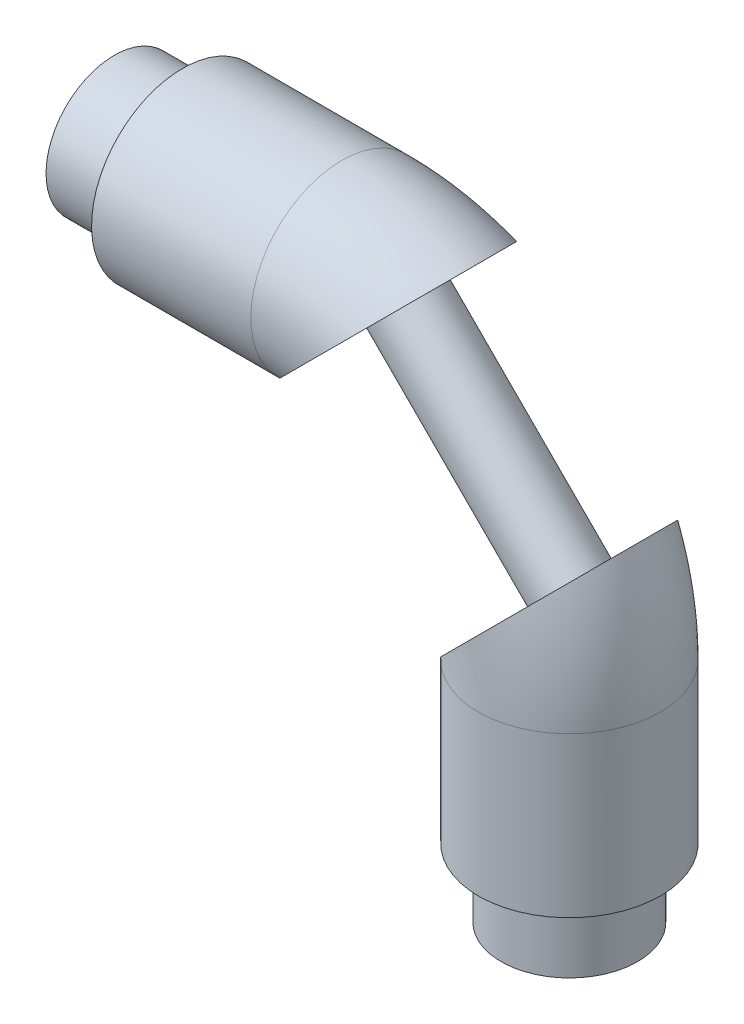
ISO-10303-21;
HEADER;
FILE_DESCRIPTION(('STEP AP214'),'2;1');
FILE_NAME('part.step','',(''),(''),'','','');
FILE_SCHEMA(('AUTOMOTIVE_DESIGN { 1 0 10303 214 1 1 1 1 }'));
ENDSEC;
DATA;
#1=APPLICATION_CONTEXT('core data for automotive mechanical design processes');
#2=APPLICATION_PROTOCOL_DEFINITION('international standard','automotive_design',2000,#1);
#3=PRODUCT_CONTEXT('',#1,'mechanical');
#4=PRODUCT('Part','Part','',(#3));
#5=PRODUCT_RELATED_PRODUCT_CATEGORY('part','',(#4));
#6=PRODUCT_DEFINITION_FORMATION('','',#4);
#7=PRODUCT_DEFINITION_CONTEXT('part definition',#1,'design');
#8=PRODUCT_DEFINITION('design','',#6,#7);
#9=PRODUCT_DEFINITION_SHAPE('','',#8);
#10=(LENGTH_UNIT() NAMED_UNIT(*) SI_UNIT(.MILLI.,.METRE.));
#11=(NAMED_UNIT(*) PLANE_ANGLE_UNIT() SI_UNIT($,.RADIAN.));
#12=(NAMED_UNIT(*) SI_UNIT($,.STERADIAN.) SOLID_ANGLE_UNIT());
#13=UNCERTAINTY_MEASURE_WITH_UNIT(LENGTH_MEASURE(1.E-05),#10,'distance_accuracy_value','');
#14=(GEOMETRIC_REPRESENTATION_CONTEXT(3) GLOBAL_UNCERTAINTY_ASSIGNED_CONTEXT((#13)) GLOBAL_UNIT_ASSIGNED_CONTEXT((#10,
#11,#12)) REPRESENTATION_CONTEXT('',''));
#15=CARTESIAN_POINT('',(0.,0.,0.));
#16=DIRECTION('',(0.,0.,1.));
#17=DIRECTION('',(1.,0.,0.));
#18=AXIS2_PLACEMENT_3D('',#15,#16,#17);
#19=CARTESIAN_POINT('',(-10.,10.,0.));
#20=DIRECTION('',(0.,0.,1.));
#21=DIRECTION('',(1.,0.,0.));
#22=AXIS2_PLACEMENT_3D('',#19,#20,#21);
#23=TOROIDAL_SURFACE('',#22,10.,4.);
#24=CARTESIAN_POINT('',(-10.0002,17.0708678118654,-2.72400158608691));
#25=CARTESIAN_POINT('',(-9.95265168058463,17.1184161312808,-2.77512351927115));
#26=CARTESIAN_POINT('',(-9.90437490872097,17.1666929031444,-2.82487186485191));
#27=CARTESIAN_POINT('',(-9.80645600651633,17.2646118053491,-2.92159553685316));
#28=CARTESIAN_POINT('',(-9.75681396128956,17.3142538505759,-2.96857103556728));
#29=CARTESIAN_POINT('',(-9.60597353217835,17.4650942796871,-3.10530395324048));
#30=CARTESIAN_POINT('',(-9.50285579575952,17.5682120161059,-3.1908732176818));
#31=CARTESIAN_POINT('',(-9.29149340002958,17.7795744118358,-3.35088564511738));
#32=CARTESIAN_POINT('',(-9.18321845588592,17.8878493559795,-3.42524856610428));
#33=CARTESIAN_POINT('',(-8.962806169225,18.1082616426404,-3.5615165804673));
#34=CARTESIAN_POINT('',(-8.85066872107243,18.220399090793,-3.62342133280868));
#35=CARTESIAN_POINT('',(-8.61637715649702,18.4546906553684,-3.73731465571486));
#36=CARTESIAN_POINT('',(-8.49402463488474,18.5770431769807,-3.78849099694695));
#37=CARTESIAN_POINT('',(-8.24655110474179,18.8245167071236,-3.87500879943189));
#38=CARTESIAN_POINT('',(-8.12143038506766,18.9496374267978,-3.91035190475286));
#39=CARTESIAN_POINT('',(-7.86973186621318,19.2013359456523,-3.96412494210874));
#40=CARTESIAN_POINT('',(-7.74315916511407,19.3279086467514,-3.9826022426813));
#41=CARTESIAN_POINT('',(-7.48935148050852,19.5817163313569,-4.00184224684835));
#42=CARTESIAN_POINT('',(-7.362116731082,19.7089510807834,-4.00261083560131));
#43=CARTESIAN_POINT('',(-7.13971991290245,19.931347898963,-3.98770779226969));
#44=CARTESIAN_POINT('',(-7.04441623408392,20.0266515777815,-3.97605930903692));
#45=CARTESIAN_POINT('',(-6.85478445350626,20.2162833583592,-3.94196996418255));
#46=CARTESIAN_POINT('',(-6.76045616073202,20.3106116511334,-3.9195312581839));
#47=CARTESIAN_POINT('',(-6.57340628812681,20.4976615237386,-3.86362840285953));
#48=CARTESIAN_POINT('',(-6.480685294171,20.5903825176945,-3.83016031862299));
#49=CARTESIAN_POINT('',(-6.29765734907611,20.7734104627893,-3.75209168535022));
#50=CARTESIAN_POINT('',(-6.20734925730838,20.8637185545571,-3.70749650322021));
#51=CARTESIAN_POINT('',(-6.0293468570954,21.0417209547701,-3.60685052347472));
#52=CARTESIAN_POINT('',(-5.94167142228141,21.129396389584,-3.55073277535727));
#53=CARTESIAN_POINT('',(-5.77037271707273,21.3006950947927,-3.42735612085415));
#54=CARTESIAN_POINT('',(-5.68674762160756,21.3843201902579,-3.36010229386694));
#55=CARTESIAN_POINT('',(-5.52437008769593,21.5466977241695,-3.21471507728029));
#56=CARTESIAN_POINT('',(-5.44561721175032,21.6254506001151,-3.13658266657318));
#57=CARTESIAN_POINT('',(-5.29384678067927,21.7772210311862,-2.96987545736549));
#58=CARTESIAN_POINT('',(-5.22082852025835,21.8502392916071,-2.88130194636865));
#59=CARTESIAN_POINT('',(-5.08865402168215,21.9824137901833,-2.70408513615794));
#60=CARTESIAN_POINT('',(-5.02884626235321,22.0422215495123,-2.6164121104192));
#61=CARTESIAN_POINT('',(-4.91510874951686,22.1559590623486,-2.43375031968751));
#62=CARTESIAN_POINT('',(-4.86117833136077,22.2098894805047,-2.33876238399074));
#63=CARTESIAN_POINT('',(-4.75977428097222,22.3112935308933,-2.14218737374575));
#64=CARTESIAN_POINT('',(-4.71229779557334,22.3587700162921,-2.04060324479666));
#65=CARTESIAN_POINT('',(-4.62428806809412,22.4467797437714,-1.83158675937074));
#66=CARTESIAN_POINT('',(-4.5837543694293,22.4873134424362,-1.72415478808341));
#67=CARTESIAN_POINT('',(-4.51319982508192,22.5578679867835,-1.51363775564464));
#68=CARTESIAN_POINT('',(-4.48257980193672,22.5884880099288,-1.41095346133806));
#69=CARTESIAN_POINT('',(-4.42782014149554,22.6432476703699,-1.20214105494106));
#70=CARTESIAN_POINT('',(-4.40368263705275,22.6673851748127,-1.09601182225193));
#71=CARTESIAN_POINT('',(-4.36215411224981,22.7089136996157,-0.881218279841107));
#72=CARTESIAN_POINT('',(-4.34475875967637,22.7263090521891,-0.772555645725331));
#73=CARTESIAN_POINT('',(-4.31686118228197,22.7542066295835,-0.553431501953658));
#74=CARTESIAN_POINT('',(-4.30636143066962,22.7647063811959,-0.442969361419619));
#75=CARTESIAN_POINT('',(-4.29269042616557,22.7783773856999,-0.226225852343734));
#76=CARTESIAN_POINT('',(-4.28920667867313,22.7818611331924,-0.119983667962518));
#77=CARTESIAN_POINT('',(-4.2886546732461,22.7824131386194,0.0925732522416568));
#78=CARTESIAN_POINT('',(-4.29158869936269,22.7794791125028,0.198888000428365));
#79=CARTESIAN_POINT('',(-4.30384727409735,22.7672205377681,0.410726332606928));
#80=CARTESIAN_POINT('',(-4.31316876739452,22.757899044471,0.516250270481975));
#81=CARTESIAN_POINT('',(-4.33811674824839,22.7329510636171,0.725834634159325));
#82=CARTESIAN_POINT('',(-4.35374556564254,22.7173222462229,0.829894504440441));
#83=CARTESIAN_POINT('',(-4.39097358165834,22.6800942302071,1.03470285163442));
#84=CARTESIAN_POINT('',(-4.41250878079811,22.6585590310674,1.13547455134908));
#85=CARTESIAN_POINT('',(-4.4614217335249,22.6096460783406,1.3341527922316));
#86=CARTESIAN_POINT('',(-4.48880158932952,22.582266222536,1.43205828803086));
#87=CARTESIAN_POINT('',(-4.57936044638908,22.4917073654764,1.72041258490704));
#88=CARTESIAN_POINT('',(-4.65099632216701,22.4200714896985,1.9057041018534));
#89=CARTESIAN_POINT('',(-4.81613592812598,22.2549318837395,2.26134650362603));
#90=CARTESIAN_POINT('',(-4.91008566375238,22.1609821481131,2.43127952610876));
#91=CARTESIAN_POINT('',(-5.11591387834778,21.9551539335177,2.74781474210786));
#92=CARTESIAN_POINT('',(-5.22779546749115,21.8432723443743,2.89441287951839));
#93=CARTESIAN_POINT('',(-5.47239842391601,21.5986693879494,3.16854455397854));
#94=CARTESIAN_POINT('',(-5.605905655579,21.4651621562865,3.29467257106363));
#95=CARTESIAN_POINT('',(-5.88507564572725,21.1859921661382,3.51620646760113));
#96=CARTESIAN_POINT('',(-6.03074214564486,21.0403256662206,3.61160284666129));
#97=CARTESIAN_POINT('',(-6.3428171683488,20.7282506435167,3.77763612839986));
#98=CARTESIAN_POINT('',(-6.50994414364555,20.5611236682199,3.84556509035585));
#99=CARTESIAN_POINT('',(-6.84945720863157,20.2216106032339,3.94515610809309));
#100=CARTESIAN_POINT('',(-7.02184480073004,20.0492230111354,3.97680770179296));
#101=CARTESIAN_POINT('',(-7.38763298775499,19.6834348241104,4.00700052907749));
#102=CARTESIAN_POINT('',(-7.58120259637254,19.4898652154929,4.00138664338646));
#103=CARTESIAN_POINT('',(-7.96571650521028,19.1053513066552,3.95017483781603));
#104=CARTESIAN_POINT('',(-8.15665837514364,18.9144094367218,3.90454213937308));
#105=CARTESIAN_POINT('',(-8.55874506848726,18.5123227433782,3.76776437083946));
#106=CARTESIAN_POINT('',(-8.76894879651726,18.3021190153482,3.67111550181167));
#107=CARTESIAN_POINT('',(-9.17692735797655,17.8941404538889,3.43534051279585));
#108=CARTESIAN_POINT('',(-9.37471008818253,17.6963577236829,3.29624171727988));
#109=CARTESIAN_POINT('',(-9.63975891786822,17.4313088939972,3.0749259287925));
#110=CARTESIAN_POINT('',(-9.71394567858342,17.357122133282,3.00884839966494));
#111=CARTESIAN_POINT('',(-9.85933111105519,17.2117367008102,2.87082291167025));
#112=CARTESIAN_POINT('',(-9.9305351900335,17.1405326218319,2.79888633988217));
#113=CARTESIAN_POINT('',(-10.0002,17.0708678118654,2.72400158608691));
#114=B_SPLINE_CURVE_WITH_KNOTS('',3,(#24,#25,#26,#27,#28,#29,#30,#31,#32,#33,#34,#35,#36,#37,
#38,#39,#40,#41,#42,#43,#44,#45,#46,#47,#48,#49,#50,#51,#52,#53,#54,#55,#56,#57,#58,#59,#60,#61,
#62,#63,#64,#65,#66,#67,#68,#69,#70,#71,#72,#73,#74,#75,#76,#77,#78,#79,#80,#81,#82,#83,#84,#85,
#86,#87,#88,#89,#90,#91,#92,#93,#94,#95,#96,#97,#98,#99,#100,#101,#102,#103,#104,#105,#106,#107,
#108,#109,#110,#111,#112,#113),.UNSPECIFIED.,.F.,.F.,(4,2,2,2,2,2,2,2,2,2,2,2,2,2,2,2,2,2,2,2,2,
2,2,2,2,2,2,2,2,2,2,2,2,2,2,2,2,2,2,2,2,2,2,2,4),(0.,0.253370642160092,0.506725524270873,
1.01340843011634,1.52356265310228,2.03373083934824,2.57434425031385,3.11490151284591,
3.65393587701441,4.19279110063007,4.59823687403159,5.00360168290001,5.4091112691333,
5.8144256437214,6.22216530725427,6.62971950193064,7.03723704715323,7.44470439339552,
7.80968501357456,8.17462431640245,8.53940175785564,8.90415520091649,9.2380608528127,
9.57207623083781,9.9058766278921,10.2397966820752,10.5584822336436,10.8772812221425,
11.1959278256839,11.514692240722,11.8301305139273,12.1456824363408,12.7761589726348,
13.4204919941315,14.0649368925746,14.7432257580067,15.4217241091871,16.1564662464066,
16.8914202236728,17.7095971832049,18.5284858892088,19.4626818678849,20.3962777804387,
20.7680824482451,21.1391810077168),.UNSPECIFIED.);
#115=CARTESIAN_POINT('',(-10.,17.0710678118654,-2.72421662819041));
#116=VERTEX_POINT('',#115);
#117=CARTESIAN_POINT('',(-10.,17.0710678118654,2.72421662819041));
#118=VERTEX_POINT('',#117);
#119=EDGE_CURVE('E11',#116,#118,#114,.T.);
#120=ORIENTED_EDGE('',*,*,#119,.F.);
#121=CARTESIAN_POINT('',(-10.,20.,0.));
#122=DIRECTION('',(-1.,0.,0.));
#123=DIRECTION('',(0.,0.,1.));
#124=AXIS2_PLACEMENT_3D('',#121,#122,#123);
#125=CIRCLE('',#124,4.);
#126=EDGE_CURVE('E130',#118,#116,#125,.T.);
#127=ORIENTED_EDGE('',*,*,#126,.F.);
#128=EDGE_LOOP('',(#120,#127));
#129=FACE_BOUND('',#128,.T.);
#130=ADVANCED_FACE('F37',(#129),#23,.T.);
#131=CARTESIAN_POINT('',(-10.,20.,0.));
#132=DIRECTION('',(-1.,0.,0.));
#133=DIRECTION('',(0.,-1.,0.));
#134=AXIS2_PLACEMENT_3D('',#131,#132,#133);
#135=CYLINDRICAL_SURFACE('',#134,4.);
#136=CARTESIAN_POINT('',(-7.07106781186544,20.,0.));
#137=DIRECTION('',(-0.707106781186551,0.707106781186544,0.));
#138=DIRECTION('',(-0.707106781186544,-0.707106781186551,0.));
#139=AXIS2_PLACEMENT_3D('',#136,#137,#138);
#140=ELLIPSE('',#139,5.65685424949235,4.);
#141=EDGE_CURVE('E41',#118,#116,#140,.F.);
#142=ORIENTED_EDGE('',*,*,#141,.F.);
#143=ORIENTED_EDGE('',*,*,#126,.T.);
#144=EDGE_LOOP('',(#142,#143));
#145=FACE_BOUND('',#144,.T.);
#146=CARTESIAN_POINT('',(-17.,20.,0.));
#147=DIRECTION('',(-1.,0.,0.));
#148=DIRECTION('',(0.,-1.,0.));
#149=AXIS2_PLACEMENT_3D('',#146,#147,#148);
#150=CIRCLE('',#149,4.);
#151=CARTESIAN_POINT('',(-17.,16.,0.));
#152=VERTEX_POINT('',#151);
#153=EDGE_CURVE('E132',#152,#152,#150,.T.);
#154=ORIENTED_EDGE('',*,*,#153,.F.);
#155=EDGE_LOOP('',(#154));
#156=FACE_BOUND('',#155,.T.);
#157=ADVANCED_FACE('F120',(#145,#156),#135,.T.);
#158=CARTESIAN_POINT('',(-17.,20.,0.));
#159=DIRECTION('',(-1.,0.,0.));
#160=DIRECTION('',(0.,-1.,0.));
#161=AXIS2_PLACEMENT_3D('',#158,#159,#160);
#162=PLANE('',#161);
#163=CARTESIAN_POINT('',(-17.,20.,0.));
#164=DIRECTION('',(-1.,0.,0.));
#165=DIRECTION('',(0.,-1.,0.));
#166=AXIS2_PLACEMENT_3D('',#163,#164,#165);
#167=CIRCLE('',#166,3.);
#168=CARTESIAN_POINT('',(-17.,17.,0.));
#169=VERTEX_POINT('',#168);
#170=EDGE_CURVE('E135',#169,#169,#167,.T.);
#171=ORIENTED_EDGE('',*,*,#170,.F.);
#172=EDGE_LOOP('',(#171));
#173=FACE_BOUND('',#172,.T.);
#174=ORIENTED_EDGE('',*,*,#153,.T.);
#175=EDGE_LOOP('',(#174));
#176=FACE_BOUND('',#175,.T.);
#177=ADVANCED_FACE('F125',(#173,#176),#162,.T.);
#178=CARTESIAN_POINT('',(-17.,20.,0.));
#179=DIRECTION('',(-1.,0.,0.));
#180=DIRECTION('',(0.,-1.,0.));
#181=AXIS2_PLACEMENT_3D('',#178,#179,#180);
#182=CYLINDRICAL_SURFACE('',#181,3.);
#183=ORIENTED_EDGE('',*,*,#170,.T.);
#184=EDGE_LOOP('',(#183));
#185=FACE_BOUND('',#184,.T.);
#186=CARTESIAN_POINT('',(-20.,20.,0.));
#187=DIRECTION('',(-1.,0.,0.));
#188=DIRECTION('',(0.,-1.,0.));
#189=AXIS2_PLACEMENT_3D('',#186,#187,#188);
#190=CIRCLE('',#189,3.);
#191=CARTESIAN_POINT('',(-20.,17.,0.));
#192=VERTEX_POINT('',#191);
#193=EDGE_CURVE('E143',#192,#192,#190,.T.);
#194=ORIENTED_EDGE('',*,*,#193,.F.);
#195=EDGE_LOOP('',(#194));
#196=FACE_BOUND('',#195,.T.);
#197=ADVANCED_FACE('F165',(#185,#196),#182,.T.);
#198=CARTESIAN_POINT('',(-20.,20.,0.));
#199=DIRECTION('',(-1.,0.,0.));
#200=DIRECTION('',(0.,0.,1.));
#201=AXIS2_PLACEMENT_3D('',#198,#199,#200);
#202=PLANE('',#201);
#203=CARTESIAN_POINT('',(-20.,20.,0.));
#204=DIRECTION('',(-1.,0.,0.));
#205=DIRECTION('',(0.,-1.,0.));
#206=AXIS2_PLACEMENT_3D('',#203,#204,#205);
#207=CIRCLE('',#206,1.6);
#208=CARTESIAN_POINT('',(-20.,18.4,0.));
#209=VERTEX_POINT('',#208);
#210=EDGE_CURVE('E146',#209,#209,#207,.T.);
#211=ORIENTED_EDGE('',*,*,#210,.F.);
#212=EDGE_LOOP('',(#211));
#213=FACE_BOUND('',#212,.T.);
#214=ORIENTED_EDGE('',*,*,#193,.T.);
#215=EDGE_LOOP('',(#214));
#216=FACE_BOUND('',#215,.T.);
#217=ADVANCED_FACE('F159',(#213,#216),#202,.T.);
#218=CARTESIAN_POINT('',(-10.,20.,0.));
#219=DIRECTION('',(-1.,0.,0.));
#220=DIRECTION('',(0.,-1.,0.));
#221=AXIS2_PLACEMENT_3D('',#218,#219,#220);
#222=CYLINDRICAL_SURFACE('',#221,1.6);
#223=CARTESIAN_POINT('',(-10.,20.,0.));
#224=DIRECTION('',(-1.,0.,0.));
#225=DIRECTION('',(0.,-1.,0.));
#226=AXIS2_PLACEMENT_3D('',#223,#224,#225);
#227=CIRCLE('',#226,1.6);
#228=CARTESIAN_POINT('',(-10.,18.4,0.));
#229=VERTEX_POINT('',#228);
#230=EDGE_CURVE('E150',#229,#229,#227,.T.);
#231=ORIENTED_EDGE('',*,*,#230,.F.);
#232=EDGE_LOOP('',(#231));
#233=FACE_BOUND('',#232,.T.);
#234=ORIENTED_EDGE('',*,*,#210,.T.);
#235=EDGE_LOOP('',(#234));
#236=FACE_BOUND('',#235,.T.);
#237=ADVANCED_FACE('F156',(#233,#236),#222,.F.);
#238=CARTESIAN_POINT('',(-10.,20.,0.));
#239=DIRECTION('',(-1.,0.,0.));
#240=DIRECTION('',(0.,-1.,0.));
#241=AXIS2_PLACEMENT_3D('',#238,#239,#240);
#242=PLANE('',#241);
#243=ORIENTED_EDGE('',*,*,#230,.T.);
#244=EDGE_LOOP('',(#243));
#245=FACE_BOUND('',#244,.T.);
#246=ADVANCED_FACE('F154',(#245),#242,.T.);
#247=CARTESIAN_POINT('',(-15.0765308423499,11.9945369695154,-4.));
#248=DIRECTION('',(-0.707106781186551,0.707106781186544,0.));
#249=DIRECTION('',(-0.707106781186544,-0.707106781186551,0.));
#250=AXIS2_PLACEMENT_3D('',#247,#248,#249);
#251=PLANE('',#250);
#252=CARTESIAN_POINT('',(-7.07106781186552,19.9999999999999,0.));
#253=DIRECTION('',(-0.707106781186552,0.707106781186543,0.));
#254=DIRECTION('',(-0.707106781186543,-0.707106781186552,0.));
#255=AXIS2_PLACEMENT_3D('',#252,#253,#254);
#256=CIRCLE('',#255,1.5);
#257=CARTESIAN_POINT('',(-8.13172798364533,18.9393398282201,0.));
#258=VERTEX_POINT('',#257);
#259=EDGE_CURVE('E89',#258,#258,#256,.T.);
#260=ORIENTED_EDGE('',*,*,#259,.T.);
#261=EDGE_LOOP('',(#260));
#262=FACE_BOUND('',#261,.T.);
#263=ORIENTED_EDGE('',*,*,#141,.T.);
#264=ORIENTED_EDGE('',*,*,#119,.T.);
#265=EDGE_LOOP('',(#263,#264));
#266=FACE_BOUND('',#265,.T.);
#267=ADVANCED_FACE('F179',(#262,#266),#251,.F.);
#268=CARTESIAN_POINT('',(-7.07106781186552,19.9999999999999,0.));
#269=DIRECTION('',(0.707106781186552,-0.707106781186543,0.));
#270=DIRECTION('',(0.707106781186543,0.707106781186552,0.));
#271=AXIS2_PLACEMENT_3D('',#268,#269,#270);
#272=CYLINDRICAL_SURFACE('',#271,1.5);
#273=ORIENTED_EDGE('',*,*,#259,.F.);
#274=EDGE_LOOP('',(#273));
#275=FACE_BOUND('',#274,.T.);
#276=CARTESIAN_POINT('',(0.,12.9289321881345,0.));
#277=DIRECTION('',(-0.707106781186552,0.707106781186543,0.));
#278=DIRECTION('',(-0.707106781186543,-0.707106781186552,0.));
#279=AXIS2_PLACEMENT_3D('',#276,#277,#278);
#280=CIRCLE('',#279,1.5);
#281=CARTESIAN_POINT('',(-1.06066017177981,11.8682720163547,0.));
#282=VERTEX_POINT('',#281);
#283=EDGE_CURVE('E67',#282,#282,#280,.T.);
#284=ORIENTED_EDGE('',*,*,#283,.T.);
#285=EDGE_LOOP('',(#284));
#286=FACE_BOUND('',#285,.T.);
#287=ADVANCED_FACE('F102',(#275,#286),#272,.T.);
#288=CARTESIAN_POINT('',(0.,10.,0.));
#289=DIRECTION('',(0.,-1.,0.));
#290=DIRECTION('',(0.,0.,-1.));
#291=AXIS2_PLACEMENT_3D('',#288,#289,#290);
#292=PLANE('',#291);
#293=CARTESIAN_POINT('',(0.,10.,0.));
#294=DIRECTION('',(0.,-1.,0.));
#295=DIRECTION('',(0.,0.,-1.));
#296=AXIS2_PLACEMENT_3D('',#293,#294,#295);
#297=CIRCLE('',#296,1.6);
#298=CARTESIAN_POINT('',(0.,10.,-1.6));
#299=VERTEX_POINT('',#298);
#300=EDGE_CURVE('E206',#299,#299,#297,.T.);
#301=ORIENTED_EDGE('',*,*,#300,.T.);
#302=EDGE_LOOP('',(#301));
#303=FACE_BOUND('',#302,.T.);
#304=ADVANCED_FACE('F98',(#303),#292,.T.);
#305=CARTESIAN_POINT('',(0.,10.,0.));
#306=DIRECTION('',(0.,-1.,0.));
#307=DIRECTION('',(0.,0.,-1.));
#308=AXIS2_PLACEMENT_3D('',#305,#306,#307);
#309=CYLINDRICAL_SURFACE('',#308,1.6);
#310=ORIENTED_EDGE('',*,*,#300,.F.);
#311=EDGE_LOOP('',(#310));
#312=FACE_BOUND('',#311,.T.);
#313=CARTESIAN_POINT('',(0.,0.,0.));
#314=DIRECTION('',(0.,-1.,0.));
#315=DIRECTION('',(0.,0.,-1.));
#316=AXIS2_PLACEMENT_3D('',#313,#314,#315);
#317=CIRCLE('',#316,1.6);
#318=CARTESIAN_POINT('',(0.,0.,-1.6));
#319=VERTEX_POINT('',#318);
#320=EDGE_CURVE('E73',#319,#319,#317,.T.);
#321=ORIENTED_EDGE('',*,*,#320,.T.);
#322=EDGE_LOOP('',(#321));
#323=FACE_BOUND('',#322,.T.);
#324=ADVANCED_FACE('F101',(#312,#323),#309,.F.);
#325=CARTESIAN_POINT('',(0.,0.,0.));
#326=DIRECTION('',(0.,1.,0.));
#327=DIRECTION('',(0.,0.,1.));
#328=AXIS2_PLACEMENT_3D('',#325,#326,#327);
#329=PLANE('',#328);
#330=ORIENTED_EDGE('',*,*,#320,.F.);
#331=EDGE_LOOP('',(#330));
#332=FACE_BOUND('',#331,.T.);
#333=CARTESIAN_POINT('',(0.,0.,0.));
#334=DIRECTION('',(0.,-1.,0.));
#335=DIRECTION('',(0.,0.,-1.));
#336=AXIS2_PLACEMENT_3D('',#333,#334,#335);
#337=CIRCLE('',#336,3.);
#338=CARTESIAN_POINT('',(0.,0.,-3.));
#339=VERTEX_POINT('',#338);
#340=EDGE_CURVE('E204',#339,#339,#337,.T.);
#341=ORIENTED_EDGE('',*,*,#340,.T.);
#342=EDGE_LOOP('',(#341));
#343=FACE_BOUND('',#342,.T.);
#344=ADVANCED_FACE('F106',(#332,#343),#329,.F.);
#345=CARTESIAN_POINT('',(0.,3.,0.));
#346=DIRECTION('',(0.,-1.,0.));
#347=DIRECTION('',(0.,0.,-1.));
#348=AXIS2_PLACEMENT_3D('',#345,#346,#347);
#349=CYLINDRICAL_SURFACE('',#348,3.);
#350=CARTESIAN_POINT('',(0.,3.,0.));
#351=DIRECTION('',(0.,-1.,0.));
#352=DIRECTION('',(0.,0.,-1.));
#353=AXIS2_PLACEMENT_3D('',#350,#351,#352);
#354=CIRCLE('',#353,3.);
#355=CARTESIAN_POINT('',(0.,3.,-3.));
#356=VERTEX_POINT('',#355);
#357=EDGE_CURVE('E79',#356,#356,#354,.T.);
#358=ORIENTED_EDGE('',*,*,#357,.T.);
#359=EDGE_LOOP('',(#358));
#360=FACE_BOUND('',#359,.T.);
#361=ORIENTED_EDGE('',*,*,#340,.F.);
#362=EDGE_LOOP('',(#361));
#363=FACE_BOUND('',#362,.T.);
#364=ADVANCED_FACE('F108',(#360,#363),#349,.T.);
#365=CARTESIAN_POINT('',(0.,3.,0.));
#366=DIRECTION('',(0.,-1.,0.));
#367=DIRECTION('',(0.,0.,-1.));
#368=AXIS2_PLACEMENT_3D('',#365,#366,#367);
#369=PLANE('',#368);
#370=ORIENTED_EDGE('',*,*,#357,.F.);
#371=EDGE_LOOP('',(#370));
#372=FACE_BOUND('',#371,.T.);
#373=CARTESIAN_POINT('',(0.,3.,0.));
#374=DIRECTION('',(0.,-1.,0.));
#375=DIRECTION('',(0.,0.,-1.));
#376=AXIS2_PLACEMENT_3D('',#373,#374,#375);
#377=CIRCLE('',#376,4.);
#378=CARTESIAN_POINT('',(0.,3.,-4.));
#379=VERTEX_POINT('',#378);
#380=EDGE_CURVE('E76',#379,#379,#377,.T.);
#381=ORIENTED_EDGE('',*,*,#380,.T.);
#382=EDGE_LOOP('',(#381));
#383=FACE_BOUND('',#382,.T.);
#384=ADVANCED_FACE('F111',(#372,#383),#369,.T.);
#385=CARTESIAN_POINT('',(-10.,10.,0.));
#386=DIRECTION('',(0.,0.,1.));
#387=DIRECTION('',(1.,0.,0.));
#388=AXIS2_PLACEMENT_3D('',#385,#386,#387);
#389=TOROIDAL_SURFACE('',#388,10.,4.);
#390=CARTESIAN_POINT('',(-2.92913218813445,9.9998,2.72400158608706));
#391=CARTESIAN_POINT('',(-2.88158386871908,10.0473483194154,2.7751235192713));
#392=CARTESIAN_POINT('',(-2.83330709685542,10.095625091279,2.82487186485206));
#393=CARTESIAN_POINT('',(-2.73538819465078,10.1935439934837,2.92159553685329));
#394=CARTESIAN_POINT('',(-2.685746149424,10.2431860387104,2.96857103556741));
#395=CARTESIAN_POINT('',(-2.53490572031278,10.3940264678217,3.1053039532406));
#396=CARTESIAN_POINT('',(-2.43178798389395,10.4971442042405,3.19087321768191));
#397=CARTESIAN_POINT('',(-2.22042558816401,10.7085065999705,3.35088564511748));
#398=CARTESIAN_POINT('',(-2.11215064402035,10.8167815441141,3.42524856610438));
#399=CARTESIAN_POINT('',(-1.89173835735942,11.037193830775,3.56151658046738));
#400=CARTESIAN_POINT('',(-1.77960090920685,11.1493312789276,3.62342133280876));
#401=CARTESIAN_POINT('',(-1.54530934463143,11.383622843503,3.73731465571493));
#402=CARTESIAN_POINT('',(-1.42295682301914,11.5059753651153,3.78849099694701));
#403=CARTESIAN_POINT('',(-1.17548329287618,11.7534488952583,3.87500879943194));
#404=CARTESIAN_POINT('',(-1.05036257320204,11.8785696149324,3.91035190475291));
#405=CARTESIAN_POINT('',(-0.798664054347544,12.1302681337869,3.96412494210877));
#406=CARTESIAN_POINT('',(-0.672091353248427,12.256840834886,3.98260224268132));
#407=CARTESIAN_POINT('',(-0.418283668642859,12.5106485194916,4.00184224684836));
#408=CARTESIAN_POINT('',(-0.291048919216336,12.6378832689181,4.00261083560131));
#409=CARTESIAN_POINT('',(-0.068652101036781,12.8602800870977,3.98770779226967));
#410=CARTESIAN_POINT('',(0.026651577781745,12.9555837659162,3.97605930903689));
#411=CARTESIAN_POINT('',(0.216283358359402,13.1452155464939,3.94196996418251));
#412=CARTESIAN_POINT('',(0.310611651133643,13.2395438392681,3.91953125818385));
#413=CARTESIAN_POINT('',(0.49766152373884,13.4265937118733,3.86362840285947));
#414=CARTESIAN_POINT('',(0.590382517694651,13.5193147058291,3.83016031862292));
#415=CARTESIAN_POINT('',(0.773410462789536,13.702342650924,3.75209168535014));
#416=CARTESIAN_POINT('',(0.863718554557266,13.7926507426918,3.70749650322012));
#417=CARTESIAN_POINT('',(1.04172095477024,13.9706531429047,3.60685052347462));
#418=CARTESIAN_POINT('',(1.12939638958422,14.0583285777187,3.55073277535716));
#419=CARTESIAN_POINT('',(1.30069509479289,14.2296272829274,3.42735612085403));
#420=CARTESIAN_POINT('',(1.38432019025806,14.3132523783926,3.36010229386681));
#421=CARTESIAN_POINT('',(1.54669772416968,14.4756299123042,3.21471507728015));
#422=CARTESIAN_POINT('',(1.62545060011529,14.5543827882498,3.13658266657304));
#423=CARTESIAN_POINT('',(1.77722103118634,14.7061532193208,2.96987545736534));
#424=CARTESIAN_POINT('',(1.85023929160725,14.7791714797418,2.8813019463685));
#425=CARTESIAN_POINT('',(1.98241379018344,14.9113459783179,2.70408513615778));
#426=CARTESIAN_POINT('',(2.04222154951238,14.9711537376469,2.61641211041904));
#427=CARTESIAN_POINT('',(2.15595906234872,15.0848912504832,2.43375031968733));
#428=CARTESIAN_POINT('',(2.2098894805048,15.1388216686393,2.33876238399056));
#429=CARTESIAN_POINT('',(2.31129353089334,15.2402257190279,2.14218737374556));
#430=CARTESIAN_POINT('',(2.35877001629223,15.2877022044267,2.04060324479647));
#431=CARTESIAN_POINT('',(2.44677974377143,15.3757119319059,1.83158675937055));
#432=CARTESIAN_POINT('',(2.48731344243624,15.4162456305708,1.72415478808322));
#433=CARTESIAN_POINT('',(2.55786798678361,15.4868001749181,1.51363775564445));
#434=CARTESIAN_POINT('',(2.58848800992881,15.5174201980633,1.41095346133786));
#435=CARTESIAN_POINT('',(2.64324767036999,15.5721798585045,1.20214105494086));
#436=CARTESIAN_POINT('',(2.66738517481277,15.5963173629473,1.09601182225173));
#437=CARTESIAN_POINT('',(2.70891369961571,15.6378458877502,0.881218279840907));
#438=CARTESIAN_POINT('',(2.72630905218914,15.6552412403237,0.772555645725129));
#439=CARTESIAN_POINT('',(2.75420662958353,15.6831388177181,0.553431501953455));
#440=CARTESIAN_POINT('',(2.76470638119587,15.6936385693304,0.442969361419416));
#441=CARTESIAN_POINT('',(2.77837738569992,15.7073095738344,0.226225852343533));
#442=CARTESIAN_POINT('',(2.78186113319236,15.7107933213269,0.119983667962317));
#443=CARTESIAN_POINT('',(2.78241313861938,15.7113453267539,-0.0925732522418554));
#444=CARTESIAN_POINT('',(2.77947911250278,15.7084113006373,-0.198888000428563));
#445=CARTESIAN_POINT('',(2.76722053776811,15.6961527259026,-0.410726332607123));
#446=CARTESIAN_POINT('',(2.75789904447095,15.6868312326055,-0.516250270482169));
#447=CARTESIAN_POINT('',(2.73295106361706,15.6618832517516,-0.725834634159517));
#448=CARTESIAN_POINT('',(2.71732224622291,15.6462544343574,-0.829894504440631));
#449=CARTESIAN_POINT('',(2.6800942302071,15.6090264183416,-1.0347028516346));
#450=CARTESIAN_POINT('',(2.65855903106732,15.5874912192018,-1.13547455134927));
#451=CARTESIAN_POINT('',(2.60964607834053,15.538578266475,-1.33415279223178));
#452=CARTESIAN_POINT('',(2.58226622253591,15.5111984106704,-1.43205828803103));
#453=CARTESIAN_POINT('',(2.49170736547634,15.4206395536109,-1.72041258490721));
#454=CARTESIAN_POINT('',(2.4200714896984,15.3490036778329,-1.90570410185356));
#455=CARTESIAN_POINT('',(2.25493188373942,15.1838640718739,-2.26134650362618));
#456=CARTESIAN_POINT('',(2.16098214811302,15.0899143362475,-2.43127952610891));
#457=CARTESIAN_POINT('',(1.9551539335176,14.8840861216521,-2.74781474210799));
#458=CARTESIAN_POINT('',(1.84327234437422,14.7722045325087,-2.89441287951852));
#459=CARTESIAN_POINT('',(1.59866938794935,14.5276015760839,-3.16854455397865));
#460=CARTESIAN_POINT('',(1.46516215628635,14.3940943444209,-3.29467257106373));
#461=CARTESIAN_POINT('',(1.1859921661381,14.1149243542726,-3.51620646760122));
#462=CARTESIAN_POINT('',(1.04032566622048,13.969257854355,-3.61160284666137));
#463=CARTESIAN_POINT('',(0.728250643516532,13.657182831651,-3.77763612839992));
#464=CARTESIAN_POINT('',(0.561123668219778,13.4900558563543,-3.8455650903559));
#465=CARTESIAN_POINT('',(0.221610603233747,13.1505427913682,-3.94515610809312));
#466=CARTESIAN_POINT('',(0.0492230111352769,12.9781551992698,-3.97680770179299));
#467=CARTESIAN_POINT('',(-0.316565175889688,12.6123670122448,-4.00700052907749));
#468=CARTESIAN_POINT('',(-0.510134784507242,12.4187974036272,-4.00138664338646));
#469=CARTESIAN_POINT('',(-0.894648693344993,12.0342834947895,-3.95017483781599));
#470=CARTESIAN_POINT('',(-1.08559056327836,11.8433416248561,-3.90454213937303));
#471=CARTESIAN_POINT('',(-1.487677256622,11.4412549315125,-3.76776437083939));
#472=CARTESIAN_POINT('',(-1.697880984652,11.2310512034825,-3.67111550181158));
#473=CARTESIAN_POINT('',(-2.1058595461113,10.8230726420232,-3.43534051279573));
#474=CARTESIAN_POINT('',(-2.30364227631728,10.6252899118172,-3.29624171727975));
#475=CARTESIAN_POINT('',(-2.56869110600292,10.3602410821315,-3.07492592879239));
#476=CARTESIAN_POINT('',(-2.64287786671807,10.2860543214164,-3.00884839966487));
#477=CARTESIAN_POINT('',(-2.78826329918973,10.1406688889447,-2.87082291167029));
#478=CARTESIAN_POINT('',(-2.85946737816799,10.0694648099665,-2.79888633988227));
#479=CARTESIAN_POINT('',(-2.92913218813445,9.9998,-2.72400158608706));
#480=B_SPLINE_CURVE_WITH_KNOTS('',3,(#390,#391,#392,#393,#394,#395,#396,#397,#398,#399,#400,
#401,#402,#403,#404,#405,#406,#407,#408,#409,#410,#411,#412,#413,#414,#415,#416,#417,#418,#419,
#420,#421,#422,#423,#424,#425,#426,#427,#428,#429,#430,#431,#432,#433,#434,#435,#436,#437,#438,
#439,#440,#441,#442,#443,#444,#445,#446,#447,#448,#449,#450,#451,#452,#453,#454,#455,#456,#457,
#458,#459,#460,#461,#462,#463,#464,#465,#466,#467,#468,#469,#470,#471,#472,#473,#474,#475,#476,
#477,#478,#479),.UNSPECIFIED.,.F.,.F.,(4,2,2,2,2,2,2,2,2,2,2,2,2,2,2,2,2,2,2,2,2,2,2,2,2,2,2,2,
2,2,2,2,2,2,2,2,2,2,2,2,2,2,2,2,4),(0.,0.253370642160092,0.506725524270874,1.01340843011633,
1.52356265310228,2.03373083934824,2.57434425031388,3.11490151284597,3.65393587701449,
4.19279110063018,4.5982368740317,5.00360168290011,5.4091112691334,5.81442564372149,
6.22216530725435,6.62971950193072,7.03723704715331,7.44470439339559,7.80968501357462,
8.17462431640252,8.53940175785571,8.90415520091654,9.23806085281275,9.57207623083786,
9.90587662789214,10.2397966820752,10.5584822336437,10.8772812221426,11.1959278256839,
11.5146922407221,11.8301305139273,12.1456824363409,12.7761589726349,13.4204919941315,
14.0649368925746,14.7432257580068,15.4217241091872,16.1564662464067,16.8914202236729,
17.709597183205,18.5284858892089,19.4626818678851,20.3962777804389,20.768082448245,
21.1391810077165),.UNSPECIFIED.);
#481=CARTESIAN_POINT('',(-2.92893218813445,10.,2.72421662819056));
#482=VERTEX_POINT('',#481);
#483=CARTESIAN_POINT('',(-2.92893218813445,10.,-2.72421662819056));
#484=VERTEX_POINT('',#483);
#485=EDGE_CURVE('E60',#482,#484,#480,.T.);
#486=ORIENTED_EDGE('',*,*,#485,.F.);
#487=CARTESIAN_POINT('',(0.,10.,0.));
#488=DIRECTION('',(0.,1.,0.));
#489=DIRECTION('',(0.,0.,1.));
#490=AXIS2_PLACEMENT_3D('',#487,#488,#489);
#491=CIRCLE('',#490,4.);
#492=EDGE_CURVE('E68',#482,#484,#491,.T.);
#493=ORIENTED_EDGE('',*,*,#492,.T.);
#494=EDGE_LOOP('',(#486,#493));
#495=FACE_BOUND('',#494,.T.);
#496=ADVANCED_FACE('F75',(#495),#389,.T.);
#497=CARTESIAN_POINT('',(0.,0.,0.));
#498=DIRECTION('',(0.,1.,0.));
#499=DIRECTION('',(0.,0.,1.));
#500=AXIS2_PLACEMENT_3D('',#497,#498,#499);
#501=CYLINDRICAL_SURFACE('',#500,4.);
#502=CARTESIAN_POINT('',(0.,12.9289321881345,0.));
#503=DIRECTION('',(0.707106781186552,-0.707106781186543,0.));
#504=DIRECTION('',(0.707106781186543,0.707106781186552,0.));
#505=AXIS2_PLACEMENT_3D('',#502,#503,#504);
#506=ELLIPSE('',#505,5.65685424949242,4.);
#507=EDGE_CURVE('E63',#484,#482,#506,.F.);
#508=ORIENTED_EDGE('',*,*,#507,.F.);
#509=ORIENTED_EDGE('',*,*,#492,.F.);
#510=EDGE_LOOP('',(#508,#509));
#511=FACE_BOUND('',#510,.T.);
#512=ORIENTED_EDGE('',*,*,#380,.F.);
#513=EDGE_LOOP('',(#512));
#514=FACE_BOUND('',#513,.T.);
#515=ADVANCED_FACE('F71',(#511,#514),#501,.T.);
#516=CARTESIAN_POINT('',(12.214033914605,25.1429661027396,-4.));
#517=DIRECTION('',(0.707106781186552,-0.707106781186543,0.));
#518=DIRECTION('',(0.707106781186543,0.707106781186552,0.));
#519=AXIS2_PLACEMENT_3D('',#516,#517,#518);
#520=PLANE('',#519);
#521=ORIENTED_EDGE('',*,*,#283,.F.);
#522=EDGE_LOOP('',(#521));
#523=FACE_BOUND('',#522,.T.);
#524=ORIENTED_EDGE('',*,*,#507,.T.);
#525=ORIENTED_EDGE('',*,*,#485,.T.);
#526=EDGE_LOOP('',(#524,#525));
#527=FACE_BOUND('',#526,.T.);
#528=ADVANCED_FACE('F62',(#523,#527),#520,.F.);
#529=CLOSED_SHELL('',(#130,#157,#177,#197,#217,#237,#246,#267,#287,#304,#324,#344,#364,#384,
#496,#515,#528));
#530=MANIFOLD_SOLID_BREP('B2',#529);
#531=ADVANCED_BREP_SHAPE_REPRESENTATION('',(#18,#530),#14);
#532=SHAPE_DEFINITION_REPRESENTATION(#9,#531);
ENDSEC;
END-ISO-10303-21;
